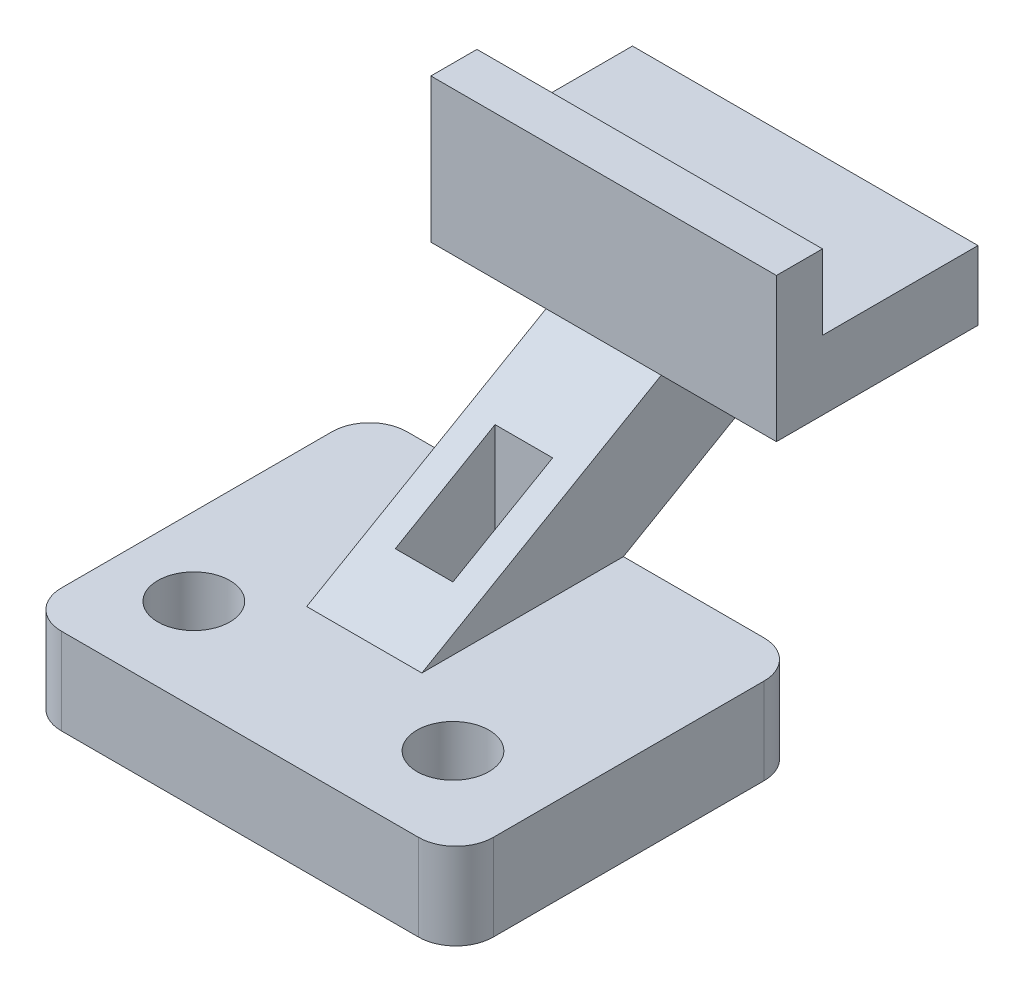
ISO-10303-21;
HEADER;
FILE_DESCRIPTION(('STEP AP214'),'2;1');
FILE_NAME('part.step','',(''),(''),'','','');
FILE_SCHEMA(('AUTOMOTIVE_DESIGN { 1 0 10303 214 1 1 1 1 }'));
ENDSEC;
DATA;
#1=APPLICATION_CONTEXT('core data for automotive mechanical design processes');
#2=APPLICATION_PROTOCOL_DEFINITION('international standard','automotive_design',2000,#1);
#3=PRODUCT_CONTEXT('',#1,'mechanical');
#4=PRODUCT('Part','Part','',(#3));
#5=PRODUCT_RELATED_PRODUCT_CATEGORY('part','',(#4));
#6=PRODUCT_DEFINITION_FORMATION('','',#4);
#7=PRODUCT_DEFINITION_CONTEXT('part definition',#1,'design');
#8=PRODUCT_DEFINITION('design','',#6,#7);
#9=PRODUCT_DEFINITION_SHAPE('','',#8);
#10=(LENGTH_UNIT() NAMED_UNIT(*) SI_UNIT(.MILLI.,.METRE.));
#11=(NAMED_UNIT(*) PLANE_ANGLE_UNIT() SI_UNIT($,.RADIAN.));
#12=(NAMED_UNIT(*) SI_UNIT($,.STERADIAN.) SOLID_ANGLE_UNIT());
#13=UNCERTAINTY_MEASURE_WITH_UNIT(LENGTH_MEASURE(1.E-05),#10,'distance_accuracy_value','');
#14=(GEOMETRIC_REPRESENTATION_CONTEXT(3) GLOBAL_UNCERTAINTY_ASSIGNED_CONTEXT((#13)) GLOBAL_UNIT_ASSIGNED_CONTEXT((#10,
#11,#12)) REPRESENTATION_CONTEXT('',''));
#15=CARTESIAN_POINT('',(0.,0.,0.));
#16=DIRECTION('',(0.,0.,1.));
#17=DIRECTION('',(1.,0.,0.));
#18=AXIS2_PLACEMENT_3D('',#15,#16,#17);
#19=CARTESIAN_POINT('',(0.,51.,0.));
#20=DIRECTION('',(0.,-1.,0.));
#21=DIRECTION('',(0.,0.,-1.));
#22=AXIS2_PLACEMENT_3D('',#19,#20,#21);
#23=PLANE('',#22);
#24=DIRECTION('',(-1.,0.,0.));
#25=VECTOR('',#24,1.);
#26=CARTESIAN_POINT('',(-31.9095903850257,51.,-45.9711652277175));
#27=LINE('',#26,#25);
#28=CARTESIAN_POINT('',(28.0904096149743,51.,-45.9711652277175));
#29=VERTEX_POINT('',#28);
#30=CARTESIAN_POINT('',(-31.9095903850257,51.,-45.9711652277175));
#31=VERTEX_POINT('',#30);
#32=EDGE_CURVE('E58',#29,#31,#27,.T.);
#33=ORIENTED_EDGE('',*,*,#32,.F.);
#34=DIRECTION('',(0.,0.,-1.));
#35=VECTOR('',#34,1.);
#36=CARTESIAN_POINT('',(28.0904096149743,51.,-37.9711652277175));
#37=LINE('',#36,#35);
#38=CARTESIAN_POINT('',(28.0904096149743,51.,-72.9711652277175));
#39=VERTEX_POINT('',#38);
#40=EDGE_CURVE('E229',#29,#39,#37,.T.);
#41=ORIENTED_EDGE('',*,*,#40,.T.);
#42=DIRECTION('',(-1.,0.,0.));
#43=VECTOR('',#42,1.);
#44=CARTESIAN_POINT('',(-31.9095903850257,51.,-72.9711652277175));
#45=LINE('',#44,#43);
#46=CARTESIAN_POINT('',(-31.9095903850257,51.,-72.9711652277175));
#47=VERTEX_POINT('',#46);
#48=EDGE_CURVE('E231',#39,#47,#45,.T.);
#49=ORIENTED_EDGE('',*,*,#48,.T.);
#50=DIRECTION('',(0.,0.,1.));
#51=VECTOR('',#50,1.);
#52=CARTESIAN_POINT('',(-31.9095903850257,51.,-37.9711652277175));
#53=LINE('',#52,#51);
#54=EDGE_CURVE('E234',#47,#31,#53,.T.);
#55=ORIENTED_EDGE('',*,*,#54,.T.);
#56=EDGE_LOOP('',(#33,#41,#49,#55));
#57=FACE_BOUND('',#56,.T.);
#58=ADVANCED_FACE('F41',(#57),#23,.F.);
#59=CARTESIAN_POINT('',(-29.4954283984517,15.,-24.9019458460644));
#60=DIRECTION('',(0.,-1.,0.));
#61=DIRECTION('',(0.,0.,-1.));
#62=AXIS2_PLACEMENT_3D('',#59,#60,#61);
#63=PLANE('',#62);
#64=CARTESIAN_POINT('',(22.5,15.,12.5980541539356));
#65=DIRECTION('',(0.,1.,0.));
#66=DIRECTION('',(0.,0.,1.));
#67=AXIS2_PLACEMENT_3D('',#64,#65,#66);
#68=CIRCLE('',#67,6.25);
#69=CARTESIAN_POINT('',(22.5,15.,18.8480541539356));
#70=VERTEX_POINT('',#69);
#71=EDGE_CURVE('E312',#70,#70,#68,.T.);
#72=ORIENTED_EDGE('',*,*,#71,.F.);
#73=EDGE_LOOP('',(#72));
#74=FACE_BOUND('',#73,.T.);
#75=CARTESIAN_POINT('',(-22.5,15.,12.5980541539356));
#76=DIRECTION('',(0.,1.,0.));
#77=DIRECTION('',(0.,0.,1.));
#78=AXIS2_PLACEMENT_3D('',#75,#76,#77);
#79=CIRCLE('',#78,6.25);
#80=CARTESIAN_POINT('',(-22.5,15.,18.8480541539356));
#81=VERTEX_POINT('',#80);
#82=EDGE_CURVE('E313',#81,#81,#79,.T.);
#83=ORIENTED_EDGE('',*,*,#82,.F.);
#84=EDGE_LOOP('',(#83));
#85=FACE_BOUND('',#84,.T.);
#86=DIRECTION('',(0.,0.,1.));
#87=VECTOR('',#86,1.);
#88=CARTESIAN_POINT('',(-11.9095903850257,15.,3.59805415393556));
#89=LINE('',#88,#87);
#90=CARTESIAN_POINT('',(-11.9095903850257,15.,-31.4019458460644));
#91=VERTEX_POINT('',#90);
#92=CARTESIAN_POINT('',(-11.9095903850257,15.,3.59805415393556));
#93=VERTEX_POINT('',#92);
#94=EDGE_CURVE('E276',#91,#93,#89,.T.);
#95=ORIENTED_EDGE('',*,*,#94,.F.);
#96=DIRECTION('',(1.,0.,0.));
#97=VECTOR('',#96,1.);
#98=CARTESIAN_POINT('',(-29.4954283984517,15.,-31.4019458460644));
#99=LINE('',#98,#97);
#100=CARTESIAN_POINT('',(-29.4954283984517,15.,-31.4019458460644));
#101=VERTEX_POINT('',#100);
#102=EDGE_CURVE('E324',#101,#91,#99,.T.);
#103=ORIENTED_EDGE('',*,*,#102,.F.);
#104=CARTESIAN_POINT('',(-29.4954283984517,15.,-24.9019458460644));
#105=DIRECTION('',(0.,-1.,0.));
#106=DIRECTION('',(0.,0.,-1.));
#107=AXIS2_PLACEMENT_3D('',#104,#105,#106);
#108=CIRCLE('',#107,6.5);
#109=CARTESIAN_POINT('',(-35.9954283984517,15.,-24.9019458460644));
#110=VERTEX_POINT('',#109);
#111=EDGE_CURVE('E319',#110,#101,#108,.T.);
#112=ORIENTED_EDGE('',*,*,#111,.F.);
#113=DIRECTION('',(0.,0.,1.));
#114=VECTOR('',#113,1.);
#115=CARTESIAN_POINT('',(-35.9954283984517,15.,-24.9019458460644));
#116=LINE('',#115,#114);
#117=CARTESIAN_POINT('',(-35.9954283984517,15.,22.0980541539356));
#118=VERTEX_POINT('',#117);
#119=EDGE_CURVE('E341',#110,#118,#116,.T.);
#120=ORIENTED_EDGE('',*,*,#119,.T.);
#121=CARTESIAN_POINT('',(-29.4954283984517,15.,22.0980541539356));
#122=DIRECTION('',(0.,-1.,0.));
#123=DIRECTION('',(0.,0.,-1.));
#124=AXIS2_PLACEMENT_3D('',#121,#122,#123);
#125=CIRCLE('',#124,6.5);
#126=CARTESIAN_POINT('',(-29.4954283984517,15.,28.5980541539356));
#127=VERTEX_POINT('',#126);
#128=EDGE_CURVE('E338',#127,#118,#125,.T.);
#129=ORIENTED_EDGE('',*,*,#128,.F.);
#130=DIRECTION('',(1.,0.,0.));
#131=VECTOR('',#130,1.);
#132=CARTESIAN_POINT('',(-29.4954283984517,15.,28.5980541539356));
#133=LINE('',#132,#131);
#134=CARTESIAN_POINT('',(32.5045716015483,15.,28.5980541539356));
#135=VERTEX_POINT('',#134);
#136=EDGE_CURVE('E336',#127,#135,#133,.T.);
#137=ORIENTED_EDGE('',*,*,#136,.T.);
#138=CARTESIAN_POINT('',(32.5045716015483,15.,22.0980541539356));
#139=DIRECTION('',(0.,-1.,0.));
#140=DIRECTION('',(0.,0.,-1.));
#141=AXIS2_PLACEMENT_3D('',#138,#139,#140);
#142=CIRCLE('',#141,6.5);
#143=CARTESIAN_POINT('',(39.0045716015483,15.,22.0980541539356));
#144=VERTEX_POINT('',#143);
#145=EDGE_CURVE('E333',#144,#135,#142,.T.);
#146=ORIENTED_EDGE('',*,*,#145,.F.);
#147=DIRECTION('',(0.,0.,1.));
#148=VECTOR('',#147,1.);
#149=CARTESIAN_POINT('',(39.0045716015483,15.,-24.9019458460644));
#150=LINE('',#149,#148);
#151=CARTESIAN_POINT('',(39.0045716015483,15.,-24.9019458460644));
#152=VERTEX_POINT('',#151);
#153=EDGE_CURVE('E330',#152,#144,#150,.T.);
#154=ORIENTED_EDGE('',*,*,#153,.F.);
#155=CARTESIAN_POINT('',(32.5045716015483,15.,-24.9019458460644));
#156=DIRECTION('',(0.,-1.,0.));
#157=DIRECTION('',(0.,0.,-1.));
#158=AXIS2_PLACEMENT_3D('',#155,#156,#157);
#159=CIRCLE('',#158,6.5);
#160=CARTESIAN_POINT('',(32.5045716015483,15.,-31.4019458460644));
#161=VERTEX_POINT('',#160);
#162=EDGE_CURVE('E327',#161,#152,#159,.T.);
#163=ORIENTED_EDGE('',*,*,#162,.F.);
#164=CARTESIAN_POINT('',(8.09040961497431,15.,-31.4019458460644));
#165=VERTEX_POINT('',#164);
#166=EDGE_CURVE('E322',#165,#161,#99,.T.);
#167=ORIENTED_EDGE('',*,*,#166,.F.);
#168=DIRECTION('',(0.,0.,-1.));
#169=VECTOR('',#168,1.);
#170=CARTESIAN_POINT('',(8.09040961497431,15.,3.59805415393556));
#171=LINE('',#170,#169);
#172=CARTESIAN_POINT('',(8.09040961497431,15.,3.59805415393556));
#173=VERTEX_POINT('',#172);
#174=EDGE_CURVE('E296',#173,#165,#171,.T.);
#175=ORIENTED_EDGE('',*,*,#174,.F.);
#176=DIRECTION('',(1.,0.,0.));
#177=VECTOR('',#176,1.);
#178=CARTESIAN_POINT('',(-11.9095903850257,15.,3.59805415393556));
#179=LINE('',#178,#177);
#180=EDGE_CURVE('E293',#93,#173,#179,.T.);
#181=ORIENTED_EDGE('',*,*,#180,.F.);
#182=EDGE_LOOP('',(#95,#103,#112,#120,#129,#137,#146,#154,#163,#167,#175,#181));
#183=FACE_BOUND('',#182,.T.);
#184=ADVANCED_FACE('F430',(#74,#85,#183),#63,.F.);
#185=CARTESIAN_POINT('',(-29.4954283984517,15.,-24.9019458460644));
#186=DIRECTION('',(0.,-1.,0.));
#187=DIRECTION('',(0.,0.,-1.));
#188=AXIS2_PLACEMENT_3D('',#185,#186,#187);
#189=CYLINDRICAL_SURFACE('',#188,6.5);
#190=CARTESIAN_POINT('',(-29.4954283984517,0.,-24.9019458460644));
#191=DIRECTION('',(0.,-1.,0.));
#192=DIRECTION('',(0.,0.,-1.));
#193=AXIS2_PLACEMENT_3D('',#190,#191,#192);
#194=CIRCLE('',#193,6.5);
#195=CARTESIAN_POINT('',(-35.9954283984517,0.,-24.9019458460644));
#196=VERTEX_POINT('',#195);
#197=CARTESIAN_POINT('',(-29.4954283984517,0.,-31.4019458460644));
#198=VERTEX_POINT('',#197);
#199=EDGE_CURVE('E344',#196,#198,#194,.T.);
#200=ORIENTED_EDGE('',*,*,#199,.F.);
#201=DIRECTION('',(0.,-1.,0.));
#202=VECTOR('',#201,1.);
#203=CARTESIAN_POINT('',(-35.9954283984517,15.,-24.9019458460644));
#204=LINE('',#203,#202);
#205=EDGE_CURVE('E11',#110,#196,#204,.T.);
#206=ORIENTED_EDGE('',*,*,#205,.F.);
#207=ORIENTED_EDGE('',*,*,#111,.T.);
#208=DIRECTION('',(0.,-1.,0.));
#209=VECTOR('',#208,1.);
#210=CARTESIAN_POINT('',(-29.4954283984517,15.,-31.4019458460644));
#211=LINE('',#210,#209);
#212=EDGE_CURVE('E343',#101,#198,#211,.T.);
#213=ORIENTED_EDGE('',*,*,#212,.T.);
#214=EDGE_LOOP('',(#200,#206,#207,#213));
#215=FACE_BOUND('',#214,.T.);
#216=ADVANCED_FACE('F43',(#215),#189,.T.);
#217=CARTESIAN_POINT('',(-35.9954283984517,15.,-24.9019458460644));
#218=DIRECTION('',(1.,0.,0.));
#219=DIRECTION('',(0.,0.,-1.));
#220=AXIS2_PLACEMENT_3D('',#217,#218,#219);
#221=PLANE('',#220);
#222=DIRECTION('',(0.,0.,1.));
#223=VECTOR('',#222,1.);
#224=CARTESIAN_POINT('',(-35.9954283984517,0.,-24.9019458460644));
#225=LINE('',#224,#223);
#226=CARTESIAN_POINT('',(-35.9954283984517,0.,22.0980541539356));
#227=VERTEX_POINT('',#226);
#228=EDGE_CURVE('E323',#196,#227,#225,.T.);
#229=ORIENTED_EDGE('',*,*,#228,.T.);
#230=DIRECTION('',(0.,-1.,0.));
#231=VECTOR('',#230,1.);
#232=CARTESIAN_POINT('',(-35.9954283984517,15.,22.0980541539356));
#233=LINE('',#232,#231);
#234=EDGE_CURVE('E50',#118,#227,#233,.T.);
#235=ORIENTED_EDGE('',*,*,#234,.F.);
#236=ORIENTED_EDGE('',*,*,#119,.F.);
#237=ORIENTED_EDGE('',*,*,#205,.T.);
#238=EDGE_LOOP('',(#229,#235,#236,#237));
#239=FACE_BOUND('',#238,.T.);
#240=ADVANCED_FACE('F428',(#239),#221,.F.);
#241=CARTESIAN_POINT('',(-29.4954283984517,15.,22.0980541539356));
#242=DIRECTION('',(0.,-1.,0.));
#243=DIRECTION('',(0.,0.,-1.));
#244=AXIS2_PLACEMENT_3D('',#241,#242,#243);
#245=CYLINDRICAL_SURFACE('',#244,6.5);
#246=CARTESIAN_POINT('',(-29.4954283984517,0.,22.0980541539356));
#247=DIRECTION('',(0.,-1.,0.));
#248=DIRECTION('',(0.,0.,-1.));
#249=AXIS2_PLACEMENT_3D('',#246,#247,#248);
#250=CIRCLE('',#249,6.5);
#251=CARTESIAN_POINT('',(-29.4954283984517,0.,28.5980541539356));
#252=VERTEX_POINT('',#251);
#253=EDGE_CURVE('E362',#252,#227,#250,.T.);
#254=ORIENTED_EDGE('',*,*,#253,.F.);
#255=DIRECTION('',(0.,-1.,0.));
#256=VECTOR('',#255,1.);
#257=CARTESIAN_POINT('',(-29.4954283984517,15.,28.5980541539356));
#258=LINE('',#257,#256);
#259=EDGE_CURVE('E368',#127,#252,#258,.T.);
#260=ORIENTED_EDGE('',*,*,#259,.F.);
#261=ORIENTED_EDGE('',*,*,#128,.T.);
#262=ORIENTED_EDGE('',*,*,#234,.T.);
#263=EDGE_LOOP('',(#254,#260,#261,#262));
#264=FACE_BOUND('',#263,.T.);
#265=ADVANCED_FACE('F424',(#264),#245,.T.);
#266=CARTESIAN_POINT('',(-29.4954283984517,15.,28.5980541539356));
#267=DIRECTION('',(0.,0.,-1.));
#268=DIRECTION('',(-1.,0.,0.));
#269=AXIS2_PLACEMENT_3D('',#266,#267,#268);
#270=PLANE('',#269);
#271=DIRECTION('',(1.,0.,0.));
#272=VECTOR('',#271,1.);
#273=CARTESIAN_POINT('',(-29.4954283984517,0.,28.5980541539356));
#274=LINE('',#273,#272);
#275=CARTESIAN_POINT('',(32.5045716015483,0.,28.5980541539356));
#276=VERTEX_POINT('',#275);
#277=EDGE_CURVE('E359',#252,#276,#274,.T.);
#278=ORIENTED_EDGE('',*,*,#277,.T.);
#279=DIRECTION('',(0.,-1.,0.));
#280=VECTOR('',#279,1.);
#281=CARTESIAN_POINT('',(32.5045716015483,15.,28.5980541539356));
#282=LINE('',#281,#280);
#283=EDGE_CURVE('E370',#135,#276,#282,.T.);
#284=ORIENTED_EDGE('',*,*,#283,.F.);
#285=ORIENTED_EDGE('',*,*,#136,.F.);
#286=ORIENTED_EDGE('',*,*,#259,.T.);
#287=EDGE_LOOP('',(#278,#284,#285,#286));
#288=FACE_BOUND('',#287,.T.);
#289=ADVANCED_FACE('F421',(#288),#270,.F.);
#290=CARTESIAN_POINT('',(32.5045716015483,15.,22.0980541539356));
#291=DIRECTION('',(0.,-1.,0.));
#292=DIRECTION('',(0.,0.,-1.));
#293=AXIS2_PLACEMENT_3D('',#290,#291,#292);
#294=CYLINDRICAL_SURFACE('',#293,6.5);
#295=CARTESIAN_POINT('',(32.5045716015483,0.,22.0980541539356));
#296=DIRECTION('',(0.,-1.,0.));
#297=DIRECTION('',(0.,0.,-1.));
#298=AXIS2_PLACEMENT_3D('',#295,#296,#297);
#299=CIRCLE('',#298,6.5);
#300=CARTESIAN_POINT('',(39.0045716015483,0.,22.0980541539356));
#301=VERTEX_POINT('',#300);
#302=EDGE_CURVE('E356',#301,#276,#299,.T.);
#303=ORIENTED_EDGE('',*,*,#302,.F.);
#304=DIRECTION('',(0.,-1.,0.));
#305=VECTOR('',#304,1.);
#306=CARTESIAN_POINT('',(39.0045716015483,15.,22.0980541539356));
#307=LINE('',#306,#305);
#308=EDGE_CURVE('E372',#144,#301,#307,.T.);
#309=ORIENTED_EDGE('',*,*,#308,.F.);
#310=ORIENTED_EDGE('',*,*,#145,.T.);
#311=ORIENTED_EDGE('',*,*,#283,.T.);
#312=EDGE_LOOP('',(#303,#309,#310,#311));
#313=FACE_BOUND('',#312,.T.);
#314=ADVANCED_FACE('F417',(#313),#294,.T.);
#315=CARTESIAN_POINT('',(39.0045716015483,15.,-24.9019458460644));
#316=DIRECTION('',(1.,0.,0.));
#317=DIRECTION('',(0.,0.,-1.));
#318=AXIS2_PLACEMENT_3D('',#315,#316,#317);
#319=PLANE('',#318);
#320=DIRECTION('',(0.,0.,1.));
#321=VECTOR('',#320,1.);
#322=CARTESIAN_POINT('',(39.0045716015483,0.,-24.9019458460644));
#323=LINE('',#322,#321);
#324=CARTESIAN_POINT('',(39.0045716015483,0.,-24.9019458460644));
#325=VERTEX_POINT('',#324);
#326=EDGE_CURVE('E353',#325,#301,#323,.T.);
#327=ORIENTED_EDGE('',*,*,#326,.F.);
#328=DIRECTION('',(0.,-1.,0.));
#329=VECTOR('',#328,1.);
#330=CARTESIAN_POINT('',(39.0045716015483,15.,-24.9019458460644));
#331=LINE('',#330,#329);
#332=EDGE_CURVE('E374',#152,#325,#331,.T.);
#333=ORIENTED_EDGE('',*,*,#332,.F.);
#334=ORIENTED_EDGE('',*,*,#153,.T.);
#335=ORIENTED_EDGE('',*,*,#308,.T.);
#336=EDGE_LOOP('',(#327,#333,#334,#335));
#337=FACE_BOUND('',#336,.T.);
#338=ADVANCED_FACE('F413',(#337),#319,.T.);
#339=CARTESIAN_POINT('',(32.5045716015483,15.,-24.9019458460644));
#340=DIRECTION('',(0.,-1.,0.));
#341=DIRECTION('',(0.,0.,-1.));
#342=AXIS2_PLACEMENT_3D('',#339,#340,#341);
#343=CYLINDRICAL_SURFACE('',#342,6.5);
#344=CARTESIAN_POINT('',(32.5045716015483,0.,-24.9019458460644));
#345=DIRECTION('',(0.,-1.,0.));
#346=DIRECTION('',(0.,0.,-1.));
#347=AXIS2_PLACEMENT_3D('',#344,#345,#346);
#348=CIRCLE('',#347,6.5);
#349=CARTESIAN_POINT('',(32.5045716015483,0.,-31.4019458460644));
#350=VERTEX_POINT('',#349);
#351=EDGE_CURVE('E350',#350,#325,#348,.T.);
#352=ORIENTED_EDGE('',*,*,#351,.F.);
#353=DIRECTION('',(0.,-1.,0.));
#354=VECTOR('',#353,1.);
#355=CARTESIAN_POINT('',(32.5045716015483,15.,-31.4019458460644));
#356=LINE('',#355,#354);
#357=EDGE_CURVE('E376',#161,#350,#356,.T.);
#358=ORIENTED_EDGE('',*,*,#357,.F.);
#359=ORIENTED_EDGE('',*,*,#162,.T.);
#360=ORIENTED_EDGE('',*,*,#332,.T.);
#361=EDGE_LOOP('',(#352,#358,#359,#360));
#362=FACE_BOUND('',#361,.T.);
#363=ADVANCED_FACE('F408',(#362),#343,.T.);
#364=CARTESIAN_POINT('',(-29.4954283984517,15.,-31.4019458460644));
#365=DIRECTION('',(0.,0.,-1.));
#366=DIRECTION('',(-1.,0.,0.));
#367=AXIS2_PLACEMENT_3D('',#364,#365,#366);
#368=PLANE('',#367);
#369=DIRECTION('',(1.,0.,0.));
#370=VECTOR('',#369,1.);
#371=CARTESIAN_POINT('',(-29.4954283984517,0.,-31.4019458460644));
#372=LINE('',#371,#370);
#373=EDGE_CURVE('E347',#198,#350,#372,.T.);
#374=ORIENTED_EDGE('',*,*,#373,.F.);
#375=ORIENTED_EDGE('',*,*,#212,.F.);
#376=ORIENTED_EDGE('',*,*,#102,.T.);
#377=DIRECTION('',(-1.,0.,0.));
#378=VECTOR('',#377,1.);
#379=CARTESIAN_POINT('',(-11.9095903850257,15.,-31.4019458460644));
#380=LINE('',#379,#378);
#381=EDGE_CURVE('E281',#165,#91,#380,.T.);
#382=ORIENTED_EDGE('',*,*,#381,.F.);
#383=ORIENTED_EDGE('',*,*,#166,.T.);
#384=ORIENTED_EDGE('',*,*,#357,.T.);
#385=EDGE_LOOP('',(#374,#375,#376,#382,#383,#384));
#386=FACE_BOUND('',#385,.T.);
#387=ADVANCED_FACE('F391',(#386),#368,.T.);
#388=CARTESIAN_POINT('',(-29.4954283984517,0.,-24.9019458460644));
#389=DIRECTION('',(0.,-1.,0.));
#390=DIRECTION('',(0.,0.,-1.));
#391=AXIS2_PLACEMENT_3D('',#388,#389,#390);
#392=PLANE('',#391);
#393=DIRECTION('',(0.,0.,1.));
#394=VECTOR('',#393,1.);
#395=CARTESIAN_POINT('',(3.09040961497431,0.,-24.9019458460644));
#396=LINE('',#395,#394);
#397=CARTESIAN_POINT('',(3.09040961497431,0.,-24.1147587671665));
#398=VERTEX_POINT('',#397);
#399=CARTESIAN_POINT('',(3.09040961497431,0.,-6.79425069147771));
#400=VERTEX_POINT('',#399);
#401=EDGE_CURVE('E274',#398,#400,#396,.T.);
#402=ORIENTED_EDGE('',*,*,#401,.F.);
#403=DIRECTION('',(1.,0.,0.));
#404=VECTOR('',#403,1.);
#405=CARTESIAN_POINT('',(-29.4954283984517,0.,-24.1147587671665));
#406=LINE('',#405,#404);
#407=CARTESIAN_POINT('',(-6.90959038502569,0.,-24.1147587671665));
#408=VERTEX_POINT('',#407);
#409=EDGE_CURVE('E263',#408,#398,#406,.T.);
#410=ORIENTED_EDGE('',*,*,#409,.F.);
#411=DIRECTION('',(0.,0.,-1.));
#412=VECTOR('',#411,1.);
#413=CARTESIAN_POINT('',(-6.90959038502569,0.,-24.9019458460644));
#414=LINE('',#413,#412);
#415=CARTESIAN_POINT('',(-6.90959038502569,0.,-6.79425069147771));
#416=VERTEX_POINT('',#415);
#417=EDGE_CURVE('E270',#416,#408,#414,.T.);
#418=ORIENTED_EDGE('',*,*,#417,.F.);
#419=DIRECTION('',(-1.,0.,0.));
#420=VECTOR('',#419,1.);
#421=CARTESIAN_POINT('',(-29.4954283984517,0.,-6.79425069147771));
#422=LINE('',#421,#420);
#423=EDGE_CURVE('E272',#400,#416,#422,.T.);
#424=ORIENTED_EDGE('',*,*,#423,.F.);
#425=EDGE_LOOP('',(#402,#410,#418,#424));
#426=FACE_BOUND('',#425,.T.);
#427=CARTESIAN_POINT('',(-22.5,0.,12.5980541539356));
#428=DIRECTION('',(0.,-1.,0.));
#429=DIRECTION('',(0.,0.,-1.));
#430=AXIS2_PLACEMENT_3D('',#427,#428,#429);
#431=CIRCLE('',#430,6.25);
#432=CARTESIAN_POINT('',(-22.5,0.,6.34805415393555));
#433=VERTEX_POINT('',#432);
#434=EDGE_CURVE('E45',#433,#433,#431,.T.);
#435=ORIENTED_EDGE('',*,*,#434,.F.);
#436=EDGE_LOOP('',(#435));
#437=FACE_BOUND('',#436,.T.);
#438=CARTESIAN_POINT('',(22.5,0.,12.5980541539356));
#439=DIRECTION('',(0.,-1.,0.));
#440=DIRECTION('',(0.,0.,-1.));
#441=AXIS2_PLACEMENT_3D('',#438,#439,#440);
#442=CIRCLE('',#441,6.25);
#443=CARTESIAN_POINT('',(22.5,0.,6.34805415393555));
#444=VERTEX_POINT('',#443);
#445=EDGE_CURVE('E316',#444,#444,#442,.T.);
#446=ORIENTED_EDGE('',*,*,#445,.F.);
#447=EDGE_LOOP('',(#446));
#448=FACE_BOUND('',#447,.T.);
#449=ORIENTED_EDGE('',*,*,#199,.T.);
#450=ORIENTED_EDGE('',*,*,#373,.T.);
#451=ORIENTED_EDGE('',*,*,#351,.T.);
#452=ORIENTED_EDGE('',*,*,#326,.T.);
#453=ORIENTED_EDGE('',*,*,#302,.T.);
#454=ORIENTED_EDGE('',*,*,#277,.F.);
#455=ORIENTED_EDGE('',*,*,#253,.T.);
#456=ORIENTED_EDGE('',*,*,#228,.F.);
#457=EDGE_LOOP('',(#449,#450,#451,#452,#453,#454,#455,#456));
#458=FACE_BOUND('',#457,.T.);
#459=ADVANCED_FACE('F387',(#426,#437,#448,#458),#392,.T.);
#460=CARTESIAN_POINT('',(22.5,-7.00000000000001,12.5980541539356));
#461=DIRECTION('',(0.,1.,0.));
#462=DIRECTION('',(0.,0.,1.));
#463=AXIS2_PLACEMENT_3D('',#460,#461,#462);
#464=CYLINDRICAL_SURFACE('',#463,6.25);
#465=ORIENTED_EDGE('',*,*,#445,.T.);
#466=EDGE_LOOP('',(#465));
#467=FACE_BOUND('',#466,.T.);
#468=ORIENTED_EDGE('',*,*,#71,.T.);
#469=EDGE_LOOP('',(#468));
#470=FACE_BOUND('',#469,.T.);
#471=ADVANCED_FACE('F390',(#467,#470),#464,.F.);
#472=CARTESIAN_POINT('',(-22.5,-7.00000000000001,12.5980541539356));
#473=DIRECTION('',(0.,1.,0.));
#474=DIRECTION('',(0.,0.,1.));
#475=AXIS2_PLACEMENT_3D('',#472,#473,#474);
#476=CYLINDRICAL_SURFACE('',#475,6.25);
#477=ORIENTED_EDGE('',*,*,#434,.T.);
#478=EDGE_LOOP('',(#477));
#479=FACE_BOUND('',#478,.T.);
#480=ORIENTED_EDGE('',*,*,#82,.T.);
#481=EDGE_LOOP('',(#480));
#482=FACE_BOUND('',#481,.T.);
#483=ADVANCED_FACE('F384',(#479,#482),#476,.F.);
#484=CARTESIAN_POINT('',(-11.9095903850257,39.,-37.9711652277175));
#485=DIRECTION('',(1.,0.,0.));
#486=DIRECTION('',(0.,0.,-1.));
#487=AXIS2_PLACEMENT_3D('',#484,#485,#486);
#488=PLANE('',#487);
#489=ORIENTED_EDGE('',*,*,#94,.T.);
#490=DIRECTION('',(0.,-0.5,0.866025403784439));
#491=VECTOR('',#490,1.);
#492=CARTESIAN_POINT('',(-11.9095903850257,39.,-37.9711652277175));
#493=LINE('',#492,#491);
#494=CARTESIAN_POINT('',(-11.9095903850257,39.,-37.9711652277175));
#495=VERTEX_POINT('',#494);
#496=EDGE_CURVE('E309',#495,#93,#493,.T.);
#497=ORIENTED_EDGE('',*,*,#496,.F.);
#498=DIRECTION('',(0.,0.,1.));
#499=VECTOR('',#498,1.);
#500=CARTESIAN_POINT('',(-11.9095903850257,39.,-37.9711652277175));
#501=LINE('',#500,#499);
#502=CARTESIAN_POINT('',(-11.9095903850257,39.,-72.9711652277175));
#503=VERTEX_POINT('',#502);
#504=EDGE_CURVE('E277',#503,#495,#501,.T.);
#505=ORIENTED_EDGE('',*,*,#504,.F.);
#506=DIRECTION('',(0.,-0.5,0.866025403784439));
#507=VECTOR('',#506,1.);
#508=CARTESIAN_POINT('',(-11.9095903850257,39.,-72.9711652277175));
#509=LINE('',#508,#507);
#510=EDGE_CURVE('E290',#503,#91,#509,.T.);
#511=ORIENTED_EDGE('',*,*,#510,.T.);
#512=EDGE_LOOP('',(#489,#497,#505,#511));
#513=FACE_BOUND('',#512,.T.);
#514=ADVANCED_FACE('F436',(#513),#488,.F.);
#515=CARTESIAN_POINT('',(-11.9095903850257,39.,-37.9711652277175));
#516=DIRECTION('',(0.,-0.866025403784439,-0.5));
#517=DIRECTION('',(0.,0.5,-0.866025403784439));
#518=AXIS2_PLACEMENT_3D('',#515,#516,#517);
#519=PLANE('',#518);
#520=DIRECTION('',(-1.,0.,0.));
#521=VECTOR('',#520,1.);
#522=CARTESIAN_POINT('',(-6.90959038502569,31.0000000000001,-24.1147587671665));
#523=LINE('',#522,#521);
#524=CARTESIAN_POINT('',(3.09040961497431,31.,-24.1147587671665));
#525=VERTEX_POINT('',#524);
#526=CARTESIAN_POINT('',(-6.90959038502569,31.0000000000001,-24.1147587671665));
#527=VERTEX_POINT('',#526);
#528=EDGE_CURVE('E252',#525,#527,#523,.T.);
#529=ORIENTED_EDGE('',*,*,#528,.F.);
#530=DIRECTION('',(0.,0.500000000000002,-0.866025403784438));
#531=VECTOR('',#530,1.);
#532=CARTESIAN_POINT('',(3.09040961497431,21.0000000000001,-6.79425069147771));
#533=LINE('',#532,#531);
#534=CARTESIAN_POINT('',(3.09040961497431,21.0000000000001,-6.79425069147771));
#535=VERTEX_POINT('',#534);
#536=EDGE_CURVE('E250',#535,#525,#533,.T.);
#537=ORIENTED_EDGE('',*,*,#536,.F.);
#538=DIRECTION('',(1.,0.,0.));
#539=VECTOR('',#538,1.);
#540=CARTESIAN_POINT('',(-6.90959038502569,21.0000000000001,-6.79425069147771));
#541=LINE('',#540,#539);
#542=CARTESIAN_POINT('',(-6.90959038502569,21.0000000000001,-6.79425069147771));
#543=VERTEX_POINT('',#542);
#544=EDGE_CURVE('E257',#543,#535,#541,.T.);
#545=ORIENTED_EDGE('',*,*,#544,.F.);
#546=DIRECTION('',(0.,-0.500000000000002,0.866025403784438));
#547=VECTOR('',#546,1.);
#548=CARTESIAN_POINT('',(-6.90959038502569,21.0000000000001,-6.79425069147771));
#549=LINE('',#548,#547);
#550=EDGE_CURVE('E254',#527,#543,#549,.T.);
#551=ORIENTED_EDGE('',*,*,#550,.F.);
#552=EDGE_LOOP('',(#529,#537,#545,#551));
#553=FACE_BOUND('',#552,.T.);
#554=ORIENTED_EDGE('',*,*,#180,.T.);
#555=DIRECTION('',(0.,-0.5,0.866025403784439));
#556=VECTOR('',#555,1.);
#557=CARTESIAN_POINT('',(8.09040961497431,39.,-37.9711652277175));
#558=LINE('',#557,#556);
#559=CARTESIAN_POINT('',(8.09040961497431,39.,-37.9711652277175));
#560=VERTEX_POINT('',#559);
#561=EDGE_CURVE('E306',#560,#173,#558,.T.);
#562=ORIENTED_EDGE('',*,*,#561,.F.);
#563=DIRECTION('',(1.,0.,0.));
#564=VECTOR('',#563,1.);
#565=CARTESIAN_POINT('',(-11.9095903850257,39.,-37.9711652277175));
#566=LINE('',#565,#564);
#567=EDGE_CURVE('E280',#495,#560,#566,.T.);
#568=ORIENTED_EDGE('',*,*,#567,.F.);
#569=ORIENTED_EDGE('',*,*,#496,.T.);
#570=EDGE_LOOP('',(#554,#562,#568,#569));
#571=FACE_BOUND('',#570,.T.);
#572=ADVANCED_FACE('F452',(#553,#571),#519,.F.);
#573=CARTESIAN_POINT('',(8.09040961497431,39.,-37.9711652277175));
#574=DIRECTION('',(-1.,0.,0.));
#575=DIRECTION('',(0.,0.,1.));
#576=AXIS2_PLACEMENT_3D('',#573,#574,#575);
#577=PLANE('',#576);
#578=ORIENTED_EDGE('',*,*,#174,.T.);
#579=DIRECTION('',(0.,-0.5,0.866025403784439));
#580=VECTOR('',#579,1.);
#581=CARTESIAN_POINT('',(8.09040961497431,39.,-72.9711652277175));
#582=LINE('',#581,#580);
#583=CARTESIAN_POINT('',(8.09040961497431,39.,-72.9711652277175));
#584=VERTEX_POINT('',#583);
#585=EDGE_CURVE('E303',#584,#165,#582,.T.);
#586=ORIENTED_EDGE('',*,*,#585,.F.);
#587=DIRECTION('',(0.,0.,-1.));
#588=VECTOR('',#587,1.);
#589=CARTESIAN_POINT('',(8.09040961497431,39.,-37.9711652277175));
#590=LINE('',#589,#588);
#591=EDGE_CURVE('E284',#560,#584,#590,.T.);
#592=ORIENTED_EDGE('',*,*,#591,.F.);
#593=ORIENTED_EDGE('',*,*,#561,.T.);
#594=EDGE_LOOP('',(#578,#586,#592,#593));
#595=FACE_BOUND('',#594,.T.);
#596=ADVANCED_FACE('F446',(#595),#577,.F.);
#597=CARTESIAN_POINT('',(-11.9095903850257,39.,-72.9711652277175));
#598=DIRECTION('',(0.,0.866025403784439,0.5));
#599=DIRECTION('',(0.,-0.5,0.866025403784439));
#600=AXIS2_PLACEMENT_3D('',#597,#598,#599);
#601=PLANE('',#600);
#602=ORIENTED_EDGE('',*,*,#381,.T.);
#603=ORIENTED_EDGE('',*,*,#510,.F.);
#604=DIRECTION('',(-1.,0.,0.));
#605=VECTOR('',#604,1.);
#606=CARTESIAN_POINT('',(-11.9095903850257,39.,-72.9711652277175));
#607=LINE('',#606,#605);
#608=EDGE_CURVE('E287',#584,#503,#607,.T.);
#609=ORIENTED_EDGE('',*,*,#608,.F.);
#610=ORIENTED_EDGE('',*,*,#585,.T.);
#611=EDGE_LOOP('',(#602,#603,#609,#610));
#612=FACE_BOUND('',#611,.T.);
#613=ADVANCED_FACE('F432',(#612),#601,.F.);
#614=CARTESIAN_POINT('',(3.09040961497431,-43.9999999999999,-6.79425069147771));
#615=DIRECTION('',(1.,0.,0.));
#616=DIRECTION('',(0.,0.,-1.));
#617=AXIS2_PLACEMENT_3D('',#614,#615,#616);
#618=PLANE('',#617);
#619=ORIENTED_EDGE('',*,*,#401,.T.);
#620=DIRECTION('',(0.,1.,0.));
#621=VECTOR('',#620,1.);
#622=CARTESIAN_POINT('',(3.09040961497431,-43.9999999999999,-6.79425069147771));
#623=LINE('',#622,#621);
#624=EDGE_CURVE('E261',#400,#535,#623,.T.);
#625=ORIENTED_EDGE('',*,*,#624,.T.);
#626=ORIENTED_EDGE('',*,*,#536,.T.);
#627=DIRECTION('',(0.,1.,0.));
#628=VECTOR('',#627,1.);
#629=CARTESIAN_POINT('',(3.09040961497431,-33.9999999999999,-24.1147587671665));
#630=LINE('',#629,#628);
#631=EDGE_CURVE('E260',#398,#525,#630,.T.);
#632=ORIENTED_EDGE('',*,*,#631,.F.);
#633=EDGE_LOOP('',(#619,#625,#626,#632));
#634=FACE_BOUND('',#633,.T.);
#635=ADVANCED_FACE('F490',(#634),#618,.F.);
#636=CARTESIAN_POINT('',(-6.90959038502569,-43.9999999999999,-6.79425069147771));
#637=DIRECTION('',(0.,0.,1.));
#638=DIRECTION('',(1.,0.,0.));
#639=AXIS2_PLACEMENT_3D('',#636,#637,#638);
#640=PLANE('',#639);
#641=ORIENTED_EDGE('',*,*,#423,.T.);
#642=DIRECTION('',(0.,1.,0.));
#643=VECTOR('',#642,1.);
#644=CARTESIAN_POINT('',(-6.90959038502569,-43.9999999999999,-6.79425069147771));
#645=LINE('',#644,#643);
#646=EDGE_CURVE('E264',#416,#543,#645,.T.);
#647=ORIENTED_EDGE('',*,*,#646,.T.);
#648=ORIENTED_EDGE('',*,*,#544,.T.);
#649=ORIENTED_EDGE('',*,*,#624,.F.);
#650=EDGE_LOOP('',(#641,#647,#648,#649));
#651=FACE_BOUND('',#650,.T.);
#652=ADVANCED_FACE('F486',(#651),#640,.F.);
#653=CARTESIAN_POINT('',(-6.90959038502569,-43.9999999999999,-6.79425069147771));
#654=DIRECTION('',(-1.,0.,0.));
#655=DIRECTION('',(0.,0.,1.));
#656=AXIS2_PLACEMENT_3D('',#653,#654,#655);
#657=PLANE('',#656);
#658=ORIENTED_EDGE('',*,*,#417,.T.);
#659=DIRECTION('',(0.,1.,0.));
#660=VECTOR('',#659,1.);
#661=CARTESIAN_POINT('',(-6.90959038502569,-33.9999999999999,-24.1147587671665));
#662=LINE('',#661,#660);
#663=EDGE_CURVE('E66',#408,#527,#662,.T.);
#664=ORIENTED_EDGE('',*,*,#663,.T.);
#665=ORIENTED_EDGE('',*,*,#550,.T.);
#666=ORIENTED_EDGE('',*,*,#646,.F.);
#667=EDGE_LOOP('',(#658,#664,#665,#666));
#668=FACE_BOUND('',#667,.T.);
#669=ADVANCED_FACE('F489',(#668),#657,.F.);
#670=CARTESIAN_POINT('',(-6.90959038502569,-33.9999999999999,-24.1147587671665));
#671=DIRECTION('',(0.,0.,-1.));
#672=DIRECTION('',(-1.,0.,0.));
#673=AXIS2_PLACEMENT_3D('',#670,#671,#672);
#674=PLANE('',#673);
#675=ORIENTED_EDGE('',*,*,#409,.T.);
#676=ORIENTED_EDGE('',*,*,#631,.T.);
#677=ORIENTED_EDGE('',*,*,#528,.T.);
#678=ORIENTED_EDGE('',*,*,#663,.F.);
#679=EDGE_LOOP('',(#675,#676,#677,#678));
#680=FACE_BOUND('',#679,.T.);
#681=ADVANCED_FACE('F494',(#680),#674,.F.);
#682=CARTESIAN_POINT('',(0.,39.,0.));
#683=DIRECTION('',(0.,-1.,0.));
#684=DIRECTION('',(0.,0.,-1.));
#685=AXIS2_PLACEMENT_3D('',#682,#683,#684);
#686=PLANE('',#685);
#687=DIRECTION('',(-1.,0.,0.));
#688=VECTOR('',#687,1.);
#689=CARTESIAN_POINT('',(-31.9095903850257,39.,-72.9711652277175));
#690=LINE('',#689,#688);
#691=CARTESIAN_POINT('',(-31.9095903850257,39.,-72.9711652277175));
#692=VERTEX_POINT('',#691);
#693=EDGE_CURVE('E238',#503,#692,#690,.T.);
#694=ORIENTED_EDGE('',*,*,#693,.F.);
#695=ORIENTED_EDGE('',*,*,#504,.T.);
#696=DIRECTION('',(1.,0.,0.));
#697=VECTOR('',#696,1.);
#698=CARTESIAN_POINT('',(-31.9095903850257,39.,-37.9711652277175));
#699=LINE('',#698,#697);
#700=CARTESIAN_POINT('',(-31.9095903850257,39.,-37.9711652277175));
#701=VERTEX_POINT('',#700);
#702=EDGE_CURVE('E232',#701,#495,#699,.T.);
#703=ORIENTED_EDGE('',*,*,#702,.F.);
#704=DIRECTION('',(0.,0.,1.));
#705=VECTOR('',#704,1.);
#706=CARTESIAN_POINT('',(-31.9095903850257,39.,-37.9711652277175));
#707=LINE('',#706,#705);
#708=EDGE_CURVE('E199',#692,#701,#707,.T.);
#709=ORIENTED_EDGE('',*,*,#708,.F.);
#710=EDGE_LOOP('',(#694,#695,#703,#709));
#711=FACE_BOUND('',#710,.T.);
#712=ADVANCED_FACE('F440',(#711),#686,.T.);
#713=CARTESIAN_POINT('',(28.0904096149743,51.,-37.9711652277175));
#714=DIRECTION('',(-1.,0.,0.));
#715=DIRECTION('',(0.,0.,1.));
#716=AXIS2_PLACEMENT_3D('',#713,#714,#715);
#717=PLANE('',#716);
#718=DIRECTION('',(0.,0.,-1.));
#719=VECTOR('',#718,1.);
#720=CARTESIAN_POINT('',(28.0904096149743,39.,-37.9711652277175));
#721=LINE('',#720,#719);
#722=CARTESIAN_POINT('',(28.0904096149743,39.,-37.9711652277175));
#723=VERTEX_POINT('',#722);
#724=CARTESIAN_POINT('',(28.0904096149743,39.,-72.9711652277175));
#725=VERTEX_POINT('',#724);
#726=EDGE_CURVE('E228',#723,#725,#721,.T.);
#727=ORIENTED_EDGE('',*,*,#726,.T.);
#728=DIRECTION('',(0.,-1.,0.));
#729=VECTOR('',#728,1.);
#730=CARTESIAN_POINT('',(28.0904096149743,51.,-72.9711652277175));
#731=LINE('',#730,#729);
#732=EDGE_CURVE('E247',#39,#725,#731,.T.);
#733=ORIENTED_EDGE('',*,*,#732,.F.);
#734=ORIENTED_EDGE('',*,*,#40,.F.);
#735=DIRECTION('',(0.,-1.,0.));
#736=VECTOR('',#735,1.);
#737=CARTESIAN_POINT('',(28.0904096149743,64.,-45.9711652277175));
#738=LINE('',#737,#736);
#739=CARTESIAN_POINT('',(28.0904096149743,64.,-45.9711652277175));
#740=VERTEX_POINT('',#739);
#741=EDGE_CURVE('E225',#740,#29,#738,.T.);
#742=ORIENTED_EDGE('',*,*,#741,.F.);
#743=DIRECTION('',(0.,0.,-1.));
#744=VECTOR('',#743,1.);
#745=CARTESIAN_POINT('',(28.0904096149743,64.,-37.9711652277175));
#746=LINE('',#745,#744);
#747=CARTESIAN_POINT('',(28.0904096149743,64.,-37.9711652277175));
#748=VERTEX_POINT('',#747);
#749=EDGE_CURVE('E212',#748,#740,#746,.T.);
#750=ORIENTED_EDGE('',*,*,#749,.F.);
#751=DIRECTION('',(0.,-1.,0.));
#752=VECTOR('',#751,1.);
#753=CARTESIAN_POINT('',(28.0904096149743,51.,-37.9711652277175));
#754=LINE('',#753,#752);
#755=EDGE_CURVE('E204',#748,#723,#754,.T.);
#756=ORIENTED_EDGE('',*,*,#755,.T.);
#757=EDGE_LOOP('',(#727,#733,#734,#742,#750,#756));
#758=FACE_BOUND('',#757,.T.);
#759=ADVANCED_FACE('F482',(#758),#717,.F.);
#760=CARTESIAN_POINT('',(-31.9095903850257,51.,-72.9711652277175));
#761=DIRECTION('',(0.,0.,1.));
#762=DIRECTION('',(1.,0.,0.));
#763=AXIS2_PLACEMENT_3D('',#760,#761,#762);
#764=PLANE('',#763);
#765=EDGE_CURVE('E239',#725,#584,#690,.T.);
#766=ORIENTED_EDGE('',*,*,#765,.T.);
#767=ORIENTED_EDGE('',*,*,#608,.T.);
#768=ORIENTED_EDGE('',*,*,#693,.T.);
#769=DIRECTION('',(0.,-1.,0.));
#770=VECTOR('',#769,1.);
#771=CARTESIAN_POINT('',(-31.9095903850257,51.,-72.9711652277175));
#772=LINE('',#771,#770);
#773=EDGE_CURVE('E203',#47,#692,#772,.T.);
#774=ORIENTED_EDGE('',*,*,#773,.F.);
#775=ORIENTED_EDGE('',*,*,#48,.F.);
#776=ORIENTED_EDGE('',*,*,#732,.T.);
#777=EDGE_LOOP('',(#766,#767,#768,#774,#775,#776));
#778=FACE_BOUND('',#777,.T.);
#779=ADVANCED_FACE('F443',(#778),#764,.F.);
#780=CARTESIAN_POINT('',(-31.9095903850257,51.,-37.9711652277175));
#781=DIRECTION('',(1.,0.,0.));
#782=DIRECTION('',(0.,0.,-1.));
#783=AXIS2_PLACEMENT_3D('',#780,#781,#782);
#784=PLANE('',#783);
#785=ORIENTED_EDGE('',*,*,#708,.T.);
#786=DIRECTION('',(0.,-1.,0.));
#787=VECTOR('',#786,1.);
#788=CARTESIAN_POINT('',(-31.9095903850257,51.,-37.9711652277175));
#789=LINE('',#788,#787);
#790=CARTESIAN_POINT('',(-31.9095903850257,64.,-37.9711652277175));
#791=VERTEX_POINT('',#790);
#792=EDGE_CURVE('E191',#791,#701,#789,.T.);
#793=ORIENTED_EDGE('',*,*,#792,.F.);
#794=DIRECTION('',(0.,0.,1.));
#795=VECTOR('',#794,1.);
#796=CARTESIAN_POINT('',(-31.9095903850257,64.,-45.9711652277175));
#797=LINE('',#796,#795);
#798=CARTESIAN_POINT('',(-31.9095903850257,64.,-45.9711652277175));
#799=VERTEX_POINT('',#798);
#800=EDGE_CURVE('E196',#799,#791,#797,.T.);
#801=ORIENTED_EDGE('',*,*,#800,.F.);
#802=DIRECTION('',(0.,-1.,0.));
#803=VECTOR('',#802,1.);
#804=CARTESIAN_POINT('',(-31.9095903850257,64.,-45.9711652277175));
#805=LINE('',#804,#803);
#806=EDGE_CURVE('E222',#799,#31,#805,.T.);
#807=ORIENTED_EDGE('',*,*,#806,.T.);
#808=ORIENTED_EDGE('',*,*,#54,.F.);
#809=ORIENTED_EDGE('',*,*,#773,.T.);
#810=EDGE_LOOP('',(#785,#793,#801,#807,#808,#809));
#811=FACE_BOUND('',#810,.T.);
#812=ADVANCED_FACE('F193',(#811),#784,.F.);
#813=CARTESIAN_POINT('',(-31.9095903850257,51.,-37.9711652277175));
#814=DIRECTION('',(0.,0.,-1.));
#815=DIRECTION('',(-1.,0.,0.));
#816=AXIS2_PLACEMENT_3D('',#813,#814,#815);
#817=PLANE('',#816);
#818=ORIENTED_EDGE('',*,*,#702,.T.);
#819=ORIENTED_EDGE('',*,*,#567,.T.);
#820=EDGE_CURVE('E243',#560,#723,#699,.T.);
#821=ORIENTED_EDGE('',*,*,#820,.T.);
#822=ORIENTED_EDGE('',*,*,#755,.F.);
#823=DIRECTION('',(1.,0.,0.));
#824=VECTOR('',#823,1.);
#825=CARTESIAN_POINT('',(-31.9095903850257,64.,-37.9711652277175));
#826=LINE('',#825,#824);
#827=EDGE_CURVE('E207',#791,#748,#826,.T.);
#828=ORIENTED_EDGE('',*,*,#827,.F.);
#829=ORIENTED_EDGE('',*,*,#792,.T.);
#830=EDGE_LOOP('',(#818,#819,#821,#822,#828,#829));
#831=FACE_BOUND('',#830,.T.);
#832=ADVANCED_FACE('F208',(#831),#817,.F.);
#833=ORIENTED_EDGE('',*,*,#820,.F.);
#834=ORIENTED_EDGE('',*,*,#591,.T.);
#835=ORIENTED_EDGE('',*,*,#765,.F.);
#836=ORIENTED_EDGE('',*,*,#726,.F.);
#837=EDGE_LOOP('',(#833,#834,#835,#836));
#838=FACE_BOUND('',#837,.T.);
#839=ADVANCED_FACE('F449',(#838),#686,.T.);
#840=CARTESIAN_POINT('',(-31.9095903850257,64.,-45.9711652277175));
#841=DIRECTION('',(0.,0.,1.));
#842=DIRECTION('',(1.,0.,0.));
#843=AXIS2_PLACEMENT_3D('',#840,#841,#842);
#844=PLANE('',#843);
#845=ORIENTED_EDGE('',*,*,#32,.T.);
#846=ORIENTED_EDGE('',*,*,#806,.F.);
#847=DIRECTION('',(-1.,0.,0.));
#848=VECTOR('',#847,1.);
#849=CARTESIAN_POINT('',(-31.9095903850257,64.,-45.9711652277175));
#850=LINE('',#849,#848);
#851=EDGE_CURVE('E216',#740,#799,#850,.T.);
#852=ORIENTED_EDGE('',*,*,#851,.F.);
#853=ORIENTED_EDGE('',*,*,#741,.T.);
#854=EDGE_LOOP('',(#845,#846,#852,#853));
#855=FACE_BOUND('',#854,.T.);
#856=ADVANCED_FACE('F472',(#855),#844,.F.);
#857=CARTESIAN_POINT('',(0.,64.,0.));
#858=DIRECTION('',(0.,1.,0.));
#859=DIRECTION('',(0.,0.,1.));
#860=AXIS2_PLACEMENT_3D('',#857,#858,#859);
#861=PLANE('',#860);
#862=ORIENTED_EDGE('',*,*,#800,.T.);
#863=ORIENTED_EDGE('',*,*,#827,.T.);
#864=ORIENTED_EDGE('',*,*,#749,.T.);
#865=ORIENTED_EDGE('',*,*,#851,.T.);
#866=EDGE_LOOP('',(#862,#863,#864,#865));
#867=FACE_BOUND('',#866,.T.);
#868=ADVANCED_FACE('F214',(#867),#861,.T.);
#869=CLOSED_SHELL('',(#58,#184,#216,#240,#265,#289,#314,#338,#363,#387,#459,#471,#483,#514,#572,
#596,#613,#635,#652,#669,#681,#712,#759,#779,#812,#832,#839,#856,#868));
#870=MANIFOLD_SOLID_BREP('B2',#869);
#871=ADVANCED_BREP_SHAPE_REPRESENTATION('',(#18,#870),#14);
#872=SHAPE_DEFINITION_REPRESENTATION(#9,#871);
ENDSEC;
END-ISO-10303-21;
